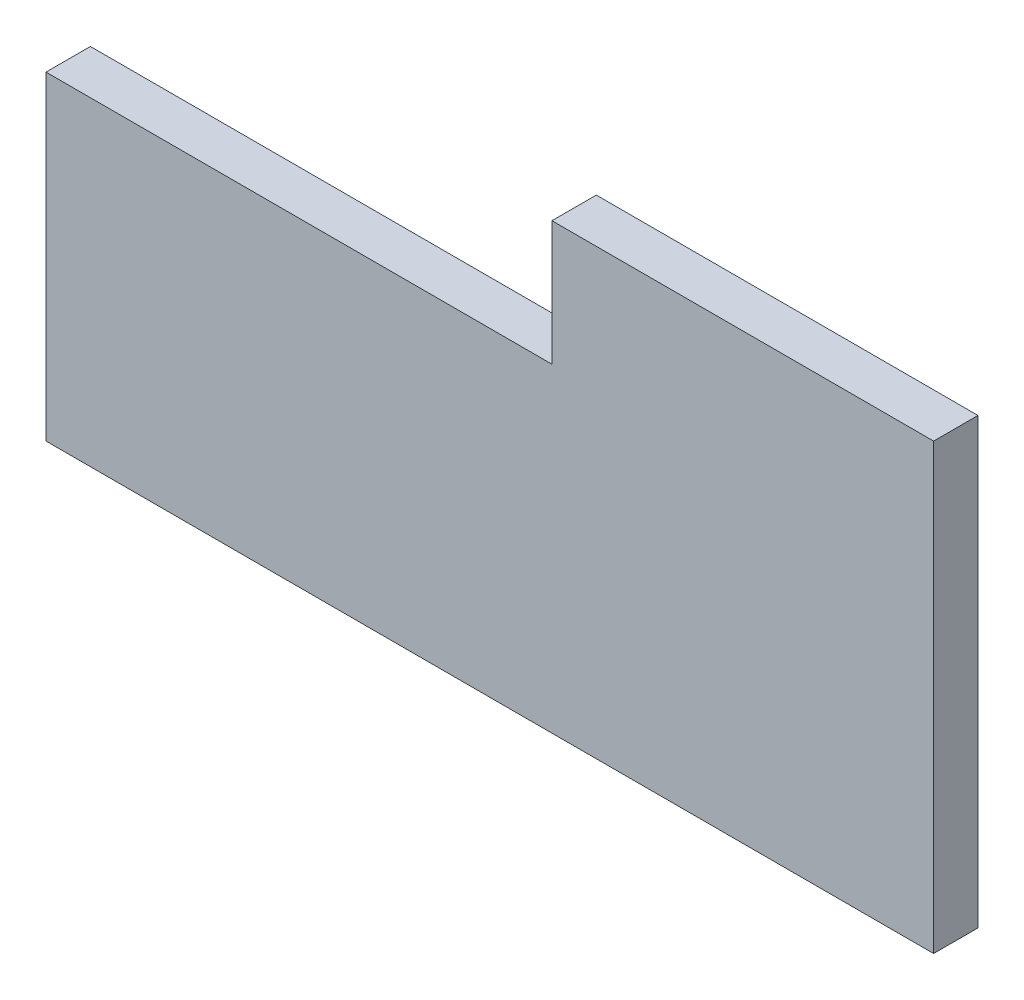
ISO-10303-21;
HEADER;
FILE_DESCRIPTION(('STEP AP214'),'2;1');
FILE_NAME('part.step','',(''),(''),'','','');
FILE_SCHEMA(('AUTOMOTIVE_DESIGN { 1 0 10303 214 1 1 1 1 }'));
ENDSEC;
DATA;
#1=APPLICATION_CONTEXT('core data for automotive mechanical design processes');
#2=APPLICATION_PROTOCOL_DEFINITION('international standard','automotive_design',2000,#1);
#3=PRODUCT_CONTEXT('',#1,'mechanical');
#4=PRODUCT('Part','Part','',(#3));
#5=PRODUCT_RELATED_PRODUCT_CATEGORY('part','',(#4));
#6=PRODUCT_DEFINITION_FORMATION('','',#4);
#7=PRODUCT_DEFINITION_CONTEXT('part definition',#1,'design');
#8=PRODUCT_DEFINITION('design','',#6,#7);
#9=PRODUCT_DEFINITION_SHAPE('','',#8);
#10=(LENGTH_UNIT() NAMED_UNIT(*) SI_UNIT(.MILLI.,.METRE.));
#11=(NAMED_UNIT(*) PLANE_ANGLE_UNIT() SI_UNIT($,.RADIAN.));
#12=(NAMED_UNIT(*) SI_UNIT($,.STERADIAN.) SOLID_ANGLE_UNIT());
#13=UNCERTAINTY_MEASURE_WITH_UNIT(LENGTH_MEASURE(1.E-05),#10,'distance_accuracy_value','');
#14=(GEOMETRIC_REPRESENTATION_CONTEXT(3) GLOBAL_UNCERTAINTY_ASSIGNED_CONTEXT((#13)) GLOBAL_UNIT_ASSIGNED_CONTEXT((#10,
#11,#12)) REPRESENTATION_CONTEXT('',''));
#15=CARTESIAN_POINT('',(0.,0.,0.));
#16=DIRECTION('',(0.,0.,1.));
#17=DIRECTION('',(1.,0.,0.));
#18=AXIS2_PLACEMENT_3D('',#15,#16,#17);
#19=CARTESIAN_POINT('',(17.78,63.5,6.35));
#20=DIRECTION('',(0.,1.,0.));
#21=DIRECTION('',(-1.,0.,0.));
#22=AXIS2_PLACEMENT_3D('',#19,#20,#21);
#23=PLANE('',#22);
#24=DIRECTION('',(1.,0.,0.));
#25=VECTOR('',#24,1.);
#26=CARTESIAN_POINT('',(17.78,63.5,-6.35));
#27=LINE('',#26,#25);
#28=CARTESIAN_POINT('',(17.78,63.5,-6.35));
#29=VERTEX_POINT('',#28);
#30=CARTESIAN_POINT('',(127.,63.5,-6.35));
#31=VERTEX_POINT('',#30);
#32=EDGE_CURVE('E130',#29,#31,#27,.T.);
#33=ORIENTED_EDGE('',*,*,#32,.F.);
#34=DIRECTION('',(0.,0.,-1.));
#35=VECTOR('',#34,1.);
#36=CARTESIAN_POINT('',(17.78,63.5,6.35));
#37=LINE('',#36,#35);
#38=CARTESIAN_POINT('',(17.78,63.5,6.35));
#39=VERTEX_POINT('',#38);
#40=EDGE_CURVE('E11',#39,#29,#37,.T.);
#41=ORIENTED_EDGE('',*,*,#40,.F.);
#42=DIRECTION('',(1.,0.,0.));
#43=VECTOR('',#42,1.);
#44=CARTESIAN_POINT('',(17.78,63.5,6.35));
#45=LINE('',#44,#43);
#46=CARTESIAN_POINT('',(127.,63.5,6.35));
#47=VERTEX_POINT('',#46);
#48=EDGE_CURVE('E150',#39,#47,#45,.T.);
#49=ORIENTED_EDGE('',*,*,#48,.T.);
#50=DIRECTION('',(0.,0.,-1.));
#51=VECTOR('',#50,1.);
#52=CARTESIAN_POINT('',(127.,63.5,6.35));
#53=LINE('',#52,#51);
#54=EDGE_CURVE('E42',#47,#31,#53,.T.);
#55=ORIENTED_EDGE('',*,*,#54,.T.);
#56=EDGE_LOOP('',(#33,#41,#49,#55));
#57=FACE_BOUND('',#56,.T.);
#58=ADVANCED_FACE('F39',(#57),#23,.T.);
#59=CARTESIAN_POINT('',(17.78,27.94,6.35));
#60=DIRECTION('',(-1.,0.,0.));
#61=DIRECTION('',(0.,-1.,0.));
#62=AXIS2_PLACEMENT_3D('',#59,#60,#61);
#63=PLANE('',#62);
#64=DIRECTION('',(0.,1.,0.));
#65=VECTOR('',#64,1.);
#66=CARTESIAN_POINT('',(17.78,27.94,-6.35));
#67=LINE('',#66,#65);
#68=CARTESIAN_POINT('',(17.78,27.94,-6.35));
#69=VERTEX_POINT('',#68);
#70=EDGE_CURVE('E147',#69,#29,#67,.T.);
#71=ORIENTED_EDGE('',*,*,#70,.F.);
#72=DIRECTION('',(0.,0.,-1.));
#73=VECTOR('',#72,1.);
#74=CARTESIAN_POINT('',(17.78,27.94,6.35));
#75=LINE('',#74,#73);
#76=CARTESIAN_POINT('',(17.78,27.94,6.35));
#77=VERTEX_POINT('',#76);
#78=EDGE_CURVE('E49',#77,#69,#75,.T.);
#79=ORIENTED_EDGE('',*,*,#78,.F.);
#80=DIRECTION('',(0.,1.,0.));
#81=VECTOR('',#80,1.);
#82=CARTESIAN_POINT('',(17.78,27.94,6.35));
#83=LINE('',#82,#81);
#84=EDGE_CURVE('E116',#77,#39,#83,.T.);
#85=ORIENTED_EDGE('',*,*,#84,.T.);
#86=ORIENTED_EDGE('',*,*,#40,.T.);
#87=EDGE_LOOP('',(#71,#79,#85,#86));
#88=FACE_BOUND('',#87,.T.);
#89=ADVANCED_FACE('F162',(#88),#63,.T.);
#90=CARTESIAN_POINT('',(-127.,27.94,6.35));
#91=DIRECTION('',(0.,1.,0.));
#92=DIRECTION('',(-1.,0.,0.));
#93=AXIS2_PLACEMENT_3D('',#90,#91,#92);
#94=PLANE('',#93);
#95=DIRECTION('',(1.,0.,0.));
#96=VECTOR('',#95,1.);
#97=CARTESIAN_POINT('',(-127.,27.94,-6.35));
#98=LINE('',#97,#96);
#99=CARTESIAN_POINT('',(-127.,27.94,-6.35));
#100=VERTEX_POINT('',#99);
#101=EDGE_CURVE('E102',#100,#69,#98,.T.);
#102=ORIENTED_EDGE('',*,*,#101,.F.);
#103=DIRECTION('',(0.,0.,-1.));
#104=VECTOR('',#103,1.);
#105=CARTESIAN_POINT('',(-127.,27.94,6.35));
#106=LINE('',#105,#104);
#107=CARTESIAN_POINT('',(-127.,27.94,6.35));
#108=VERTEX_POINT('',#107);
#109=EDGE_CURVE('E97',#108,#100,#106,.T.);
#110=ORIENTED_EDGE('',*,*,#109,.F.);
#111=DIRECTION('',(1.,0.,0.));
#112=VECTOR('',#111,1.);
#113=CARTESIAN_POINT('',(-127.,27.94,6.35));
#114=LINE('',#113,#112);
#115=EDGE_CURVE('E100',#108,#77,#114,.T.);
#116=ORIENTED_EDGE('',*,*,#115,.T.);
#117=ORIENTED_EDGE('',*,*,#78,.T.);
#118=EDGE_LOOP('',(#102,#110,#116,#117));
#119=FACE_BOUND('',#118,.T.);
#120=ADVANCED_FACE('F99',(#119),#94,.T.);
#121=CARTESIAN_POINT('',(-127.,-63.5,6.35));
#122=DIRECTION('',(-1.,0.,0.));
#123=DIRECTION('',(0.,-1.,0.));
#124=AXIS2_PLACEMENT_3D('',#121,#122,#123);
#125=PLANE('',#124);
#126=DIRECTION('',(0.,1.,0.));
#127=VECTOR('',#126,1.);
#128=CARTESIAN_POINT('',(-127.,-63.5,-6.35));
#129=LINE('',#128,#127);
#130=CARTESIAN_POINT('',(-127.,-63.5,-6.35));
#131=VERTEX_POINT('',#130);
#132=EDGE_CURVE('E142',#131,#100,#129,.T.);
#133=ORIENTED_EDGE('',*,*,#132,.F.);
#134=DIRECTION('',(0.,0.,-1.));
#135=VECTOR('',#134,1.);
#136=CARTESIAN_POINT('',(-127.,-63.5,6.35));
#137=LINE('',#136,#135);
#138=CARTESIAN_POINT('',(-127.,-63.5,6.35));
#139=VERTEX_POINT('',#138);
#140=EDGE_CURVE('E108',#139,#131,#137,.T.);
#141=ORIENTED_EDGE('',*,*,#140,.F.);
#142=DIRECTION('',(0.,1.,0.));
#143=VECTOR('',#142,1.);
#144=CARTESIAN_POINT('',(-127.,-63.5,6.35));
#145=LINE('',#144,#143);
#146=EDGE_CURVE('E114',#139,#108,#145,.T.);
#147=ORIENTED_EDGE('',*,*,#146,.T.);
#148=ORIENTED_EDGE('',*,*,#109,.T.);
#149=EDGE_LOOP('',(#133,#141,#147,#148));
#150=FACE_BOUND('',#149,.T.);
#151=ADVANCED_FACE('F119',(#150),#125,.T.);
#152=CARTESIAN_POINT('',(127.,-63.5,6.35));
#153=DIRECTION('',(0.,-1.,0.));
#154=DIRECTION('',(1.,0.,0.));
#155=AXIS2_PLACEMENT_3D('',#152,#153,#154);
#156=PLANE('',#155);
#157=DIRECTION('',(-1.,0.,0.));
#158=VECTOR('',#157,1.);
#159=CARTESIAN_POINT('',(127.,-63.5,-6.35));
#160=LINE('',#159,#158);
#161=CARTESIAN_POINT('',(127.,-63.5,-6.35));
#162=VERTEX_POINT('',#161);
#163=EDGE_CURVE('E138',#162,#131,#160,.T.);
#164=ORIENTED_EDGE('',*,*,#163,.F.);
#165=DIRECTION('',(0.,0.,-1.));
#166=VECTOR('',#165,1.);
#167=CARTESIAN_POINT('',(127.,-63.5,6.35));
#168=LINE('',#167,#166);
#169=CARTESIAN_POINT('',(127.,-63.5,6.35));
#170=VERTEX_POINT('',#169);
#171=EDGE_CURVE('E155',#170,#162,#168,.T.);
#172=ORIENTED_EDGE('',*,*,#171,.F.);
#173=DIRECTION('',(-1.,0.,0.));
#174=VECTOR('',#173,1.);
#175=CARTESIAN_POINT('',(127.,-63.5,6.35));
#176=LINE('',#175,#174);
#177=EDGE_CURVE('E121',#170,#139,#176,.T.);
#178=ORIENTED_EDGE('',*,*,#177,.T.);
#179=ORIENTED_EDGE('',*,*,#140,.T.);
#180=EDGE_LOOP('',(#164,#172,#178,#179));
#181=FACE_BOUND('',#180,.T.);
#182=ADVANCED_FACE('F175',(#181),#156,.T.);
#183=CARTESIAN_POINT('',(127.,63.5,6.35));
#184=DIRECTION('',(1.,0.,0.));
#185=DIRECTION('',(0.,1.,0.));
#186=AXIS2_PLACEMENT_3D('',#183,#184,#185);
#187=PLANE('',#186);
#188=DIRECTION('',(0.,-1.,0.));
#189=VECTOR('',#188,1.);
#190=CARTESIAN_POINT('',(127.,63.5,-6.35));
#191=LINE('',#190,#189);
#192=EDGE_CURVE('E134',#31,#162,#191,.T.);
#193=ORIENTED_EDGE('',*,*,#192,.F.);
#194=ORIENTED_EDGE('',*,*,#54,.F.);
#195=DIRECTION('',(0.,-1.,0.));
#196=VECTOR('',#195,1.);
#197=CARTESIAN_POINT('',(127.,63.5,6.35));
#198=LINE('',#197,#196);
#199=EDGE_CURVE('E124',#47,#170,#198,.T.);
#200=ORIENTED_EDGE('',*,*,#199,.T.);
#201=ORIENTED_EDGE('',*,*,#171,.T.);
#202=EDGE_LOOP('',(#193,#194,#200,#201));
#203=FACE_BOUND('',#202,.T.);
#204=ADVANCED_FACE('F159',(#203),#187,.T.);
#205=CARTESIAN_POINT('',(0.,0.,6.35));
#206=DIRECTION('',(0.,0.,-1.));
#207=DIRECTION('',(-1.,0.,0.));
#208=AXIS2_PLACEMENT_3D('',#205,#206,#207);
#209=PLANE('',#208);
#210=ORIENTED_EDGE('',*,*,#48,.F.);
#211=ORIENTED_EDGE('',*,*,#84,.F.);
#212=ORIENTED_EDGE('',*,*,#115,.F.);
#213=ORIENTED_EDGE('',*,*,#146,.F.);
#214=ORIENTED_EDGE('',*,*,#177,.F.);
#215=ORIENTED_EDGE('',*,*,#199,.F.);
#216=EDGE_LOOP('',(#210,#211,#212,#213,#214,#215));
#217=FACE_BOUND('',#216,.T.);
#218=ADVANCED_FACE('F112',(#217),#209,.F.);
#219=CARTESIAN_POINT('',(0.,0.,-6.35));
#220=DIRECTION('',(0.,0.,-1.));
#221=DIRECTION('',(-1.,0.,0.));
#222=AXIS2_PLACEMENT_3D('',#219,#220,#221);
#223=PLANE('',#222);
#224=ORIENTED_EDGE('',*,*,#32,.T.);
#225=ORIENTED_EDGE('',*,*,#192,.T.);
#226=ORIENTED_EDGE('',*,*,#163,.T.);
#227=ORIENTED_EDGE('',*,*,#132,.T.);
#228=ORIENTED_EDGE('',*,*,#101,.T.);
#229=ORIENTED_EDGE('',*,*,#70,.T.);
#230=EDGE_LOOP('',(#224,#225,#226,#227,#228,#229));
#231=FACE_BOUND('',#230,.T.);
#232=ADVANCED_FACE('F161',(#231),#223,.T.);
#233=CLOSED_SHELL('',(#58,#89,#120,#151,#182,#204,#218,#232));
#234=MANIFOLD_SOLID_BREP('B2',#233);
#235=ADVANCED_BREP_SHAPE_REPRESENTATION('',(#18,#234),#14);
#236=SHAPE_DEFINITION_REPRESENTATION(#9,#235);
ENDSEC;
END-ISO-10303-21;
